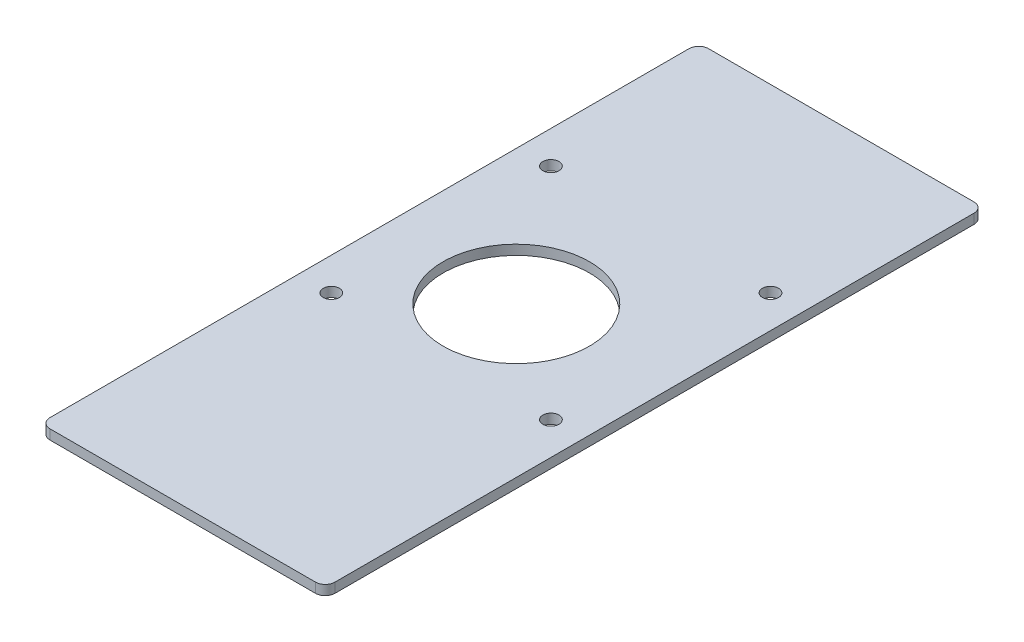
ISO-10303-21;
HEADER;
FILE_DESCRIPTION(('STEP AP214'),'2;1');
FILE_NAME('part.step','',(''),(''),'','','');
FILE_SCHEMA(('AUTOMOTIVE_DESIGN { 1 0 10303 214 1 1 1 1 }'));
ENDSEC;
DATA;
#1=APPLICATION_CONTEXT('core data for automotive mechanical design processes');
#2=APPLICATION_PROTOCOL_DEFINITION('international standard','automotive_design',2000,#1);
#3=PRODUCT_CONTEXT('',#1,'mechanical');
#4=PRODUCT('Part','Part','',(#3));
#5=PRODUCT_RELATED_PRODUCT_CATEGORY('part','',(#4));
#6=PRODUCT_DEFINITION_FORMATION('','',#4);
#7=PRODUCT_DEFINITION_CONTEXT('part definition',#1,'design');
#8=PRODUCT_DEFINITION('design','',#6,#7);
#9=PRODUCT_DEFINITION_SHAPE('','',#8);
#10=(LENGTH_UNIT() NAMED_UNIT(*) SI_UNIT(.MILLI.,.METRE.));
#11=(NAMED_UNIT(*) PLANE_ANGLE_UNIT() SI_UNIT($,.RADIAN.));
#12=(NAMED_UNIT(*) SI_UNIT($,.STERADIAN.) SOLID_ANGLE_UNIT());
#13=UNCERTAINTY_MEASURE_WITH_UNIT(LENGTH_MEASURE(1.E-05),#10,'distance_accuracy_value','');
#14=(GEOMETRIC_REPRESENTATION_CONTEXT(3) GLOBAL_UNCERTAINTY_ASSIGNED_CONTEXT((#13)) GLOBAL_UNIT_ASSIGNED_CONTEXT((#10,
#11,#12)) REPRESENTATION_CONTEXT('',''));
#15=CARTESIAN_POINT('',(0.,0.,0.));
#16=DIRECTION('',(0.,0.,1.));
#17=DIRECTION('',(1.,0.,0.));
#18=AXIS2_PLACEMENT_3D('',#15,#16,#17);
#19=CARTESIAN_POINT('',(-46.6901204704536,2.,-45.7097521955371));
#20=DIRECTION('',(1.,0.,0.));
#21=DIRECTION('',(0.,0.,-1.));
#22=AXIS2_PLACEMENT_3D('',#19,#20,#21);
#23=PLANE('',#22);
#24=DIRECTION('',(0.,0.,1.));
#25=VECTOR('',#24,1.);
#26=CARTESIAN_POINT('',(-46.6901204704536,2.,-45.7097521955371));
#27=LINE('',#26,#25);
#28=CARTESIAN_POINT('',(-46.6901204704536,2.,-43.7097521955371));
#29=VERTEX_POINT('',#28);
#30=CARTESIAN_POINT('',(-46.6901204704536,2.,87.240247804463));
#31=VERTEX_POINT('',#30);
#32=EDGE_CURVE('E129',#29,#31,#27,.T.);
#33=ORIENTED_EDGE('',*,*,#32,.F.);
#34=DIRECTION('',(0.,-1.,0.));
#35=VECTOR('',#34,1.);
#36=CARTESIAN_POINT('',(-46.6901204704536,2.,-43.7097521955371));
#37=LINE('',#36,#35);
#38=CARTESIAN_POINT('',(-46.6901204704536,0.,-43.7097521955371));
#39=VERTEX_POINT('',#38);
#40=EDGE_CURVE('E155',#29,#39,#37,.T.);
#41=ORIENTED_EDGE('',*,*,#40,.T.);
#42=DIRECTION('',(0.,0.,1.));
#43=VECTOR('',#42,1.);
#44=CARTESIAN_POINT('',(-46.6901204704536,0.,-45.7097521955371));
#45=LINE('',#44,#43);
#46=CARTESIAN_POINT('',(-46.6901204704536,0.,87.240247804463));
#47=VERTEX_POINT('',#46);
#48=EDGE_CURVE('E163',#39,#47,#45,.T.);
#49=ORIENTED_EDGE('',*,*,#48,.T.);
#50=DIRECTION('',(0.,-1.,0.));
#51=VECTOR('',#50,1.);
#52=CARTESIAN_POINT('',(-46.6901204704536,2.,87.240247804463));
#53=LINE('',#52,#51);
#54=EDGE_CURVE('E153',#47,#31,#53,.F.);
#55=ORIENTED_EDGE('',*,*,#54,.T.);
#56=EDGE_LOOP('',(#33,#41,#49,#55));
#57=FACE_BOUND('',#56,.T.);
#58=ADVANCED_FACE('F38',(#57),#23,.F.);
#59=CARTESIAN_POINT('',(-46.6901204704536,2.,89.240247804463));
#60=DIRECTION('',(0.,0.,-1.));
#61=DIRECTION('',(-1.,0.,0.));
#62=AXIS2_PLACEMENT_3D('',#59,#60,#61);
#63=PLANE('',#62);
#64=DIRECTION('',(1.,0.,0.));
#65=VECTOR('',#64,1.);
#66=CARTESIAN_POINT('',(-46.6901204704536,0.,89.240247804463));
#67=LINE('',#66,#65);
#68=CARTESIAN_POINT('',(-44.6901204704536,0.,89.240247804463));
#69=VERTEX_POINT('',#68);
#70=CARTESIAN_POINT('',(9.70987952954636,0.,89.240247804463));
#71=VERTEX_POINT('',#70);
#72=EDGE_CURVE('E134',#69,#71,#67,.T.);
#73=ORIENTED_EDGE('',*,*,#72,.T.);
#74=DIRECTION('',(0.,-1.,0.));
#75=VECTOR('',#74,1.);
#76=CARTESIAN_POINT('',(9.70987952954636,2.,89.240247804463));
#77=LINE('',#76,#75);
#78=CARTESIAN_POINT('',(9.70987952954636,2.,89.240247804463));
#79=VERTEX_POINT('',#78);
#80=EDGE_CURVE('E11',#71,#79,#77,.F.);
#81=ORIENTED_EDGE('',*,*,#80,.T.);
#82=DIRECTION('',(1.,0.,0.));
#83=VECTOR('',#82,1.);
#84=CARTESIAN_POINT('',(-46.6901204704536,2.,89.240247804463));
#85=LINE('',#84,#83);
#86=CARTESIAN_POINT('',(-44.6901204704536,2.,89.240247804463));
#87=VERTEX_POINT('',#86);
#88=EDGE_CURVE('E132',#87,#79,#85,.T.);
#89=ORIENTED_EDGE('',*,*,#88,.F.);
#90=DIRECTION('',(0.,-1.,0.));
#91=VECTOR('',#90,1.);
#92=CARTESIAN_POINT('',(-44.6901204704536,2.,89.240247804463));
#93=LINE('',#92,#91);
#94=EDGE_CURVE('E46',#87,#69,#93,.T.);
#95=ORIENTED_EDGE('',*,*,#94,.T.);
#96=EDGE_LOOP('',(#73,#81,#89,#95));
#97=FACE_BOUND('',#96,.T.);
#98=ADVANCED_FACE('F160',(#97),#63,.F.);
#99=CARTESIAN_POINT('',(11.7098795295463,2.,-45.7097521955371));
#100=DIRECTION('',(-1.,0.,0.));
#101=DIRECTION('',(0.,0.,1.));
#102=AXIS2_PLACEMENT_3D('',#99,#100,#101);
#103=PLANE('',#102);
#104=DIRECTION('',(0.,0.,-1.));
#105=VECTOR('',#104,1.);
#106=CARTESIAN_POINT('',(11.7098795295463,0.,-45.7097521955371));
#107=LINE('',#106,#105);
#108=CARTESIAN_POINT('',(11.7098795295464,0.,87.240247804463));
#109=VERTEX_POINT('',#108);
#110=CARTESIAN_POINT('',(11.7098795295463,0.,-43.7097521955371));
#111=VERTEX_POINT('',#110);
#112=EDGE_CURVE('E130',#109,#111,#107,.T.);
#113=ORIENTED_EDGE('',*,*,#112,.T.);
#114=DIRECTION('',(0.,-1.,0.));
#115=VECTOR('',#114,1.);
#116=CARTESIAN_POINT('',(11.7098795295463,2.,-43.7097521955371));
#117=LINE('',#116,#115);
#118=CARTESIAN_POINT('',(11.7098795295463,2.,-43.7097521955371));
#119=VERTEX_POINT('',#118);
#120=EDGE_CURVE('E108',#111,#119,#117,.F.);
#121=ORIENTED_EDGE('',*,*,#120,.T.);
#122=DIRECTION('',(0.,0.,-1.));
#123=VECTOR('',#122,1.);
#124=CARTESIAN_POINT('',(11.7098795295463,2.,-45.7097521955371));
#125=LINE('',#124,#123);
#126=CARTESIAN_POINT('',(11.7098795295464,2.,87.240247804463));
#127=VERTEX_POINT('',#126);
#128=EDGE_CURVE('E168',#127,#119,#125,.T.);
#129=ORIENTED_EDGE('',*,*,#128,.F.);
#130=DIRECTION('',(0.,-1.,0.));
#131=VECTOR('',#130,1.);
#132=CARTESIAN_POINT('',(11.7098795295464,2.,87.240247804463));
#133=LINE('',#132,#131);
#134=EDGE_CURVE('E113',#127,#109,#133,.T.);
#135=ORIENTED_EDGE('',*,*,#134,.T.);
#136=EDGE_LOOP('',(#113,#121,#129,#135));
#137=FACE_BOUND('',#136,.T.);
#138=ADVANCED_FACE('F226',(#137),#103,.F.);
#139=CARTESIAN_POINT('',(-46.6901204704536,2.,-45.7097521955371));
#140=DIRECTION('',(0.,0.,1.));
#141=DIRECTION('',(1.,0.,0.));
#142=AXIS2_PLACEMENT_3D('',#139,#140,#141);
#143=PLANE('',#142);
#144=DIRECTION('',(-1.,0.,0.));
#145=VECTOR('',#144,1.);
#146=CARTESIAN_POINT('',(-46.6901204704536,2.,-45.7097521955371));
#147=LINE('',#146,#145);
#148=CARTESIAN_POINT('',(9.70987952954633,2.,-45.7097521955371));
#149=VERTEX_POINT('',#148);
#150=CARTESIAN_POINT('',(-44.6901204704536,2.,-45.7097521955371));
#151=VERTEX_POINT('',#150);
#152=EDGE_CURVE('E123',#149,#151,#147,.T.);
#153=ORIENTED_EDGE('',*,*,#152,.F.);
#154=DIRECTION('',(0.,-1.,0.));
#155=VECTOR('',#154,1.);
#156=CARTESIAN_POINT('',(9.70987952954633,2.,-45.7097521955371));
#157=LINE('',#156,#155);
#158=CARTESIAN_POINT('',(9.70987952954633,0.,-45.7097521955371));
#159=VERTEX_POINT('',#158);
#160=EDGE_CURVE('E107',#149,#159,#157,.T.);
#161=ORIENTED_EDGE('',*,*,#160,.T.);
#162=DIRECTION('',(-1.,0.,0.));
#163=VECTOR('',#162,1.);
#164=CARTESIAN_POINT('',(-46.6901204704536,0.,-45.7097521955371));
#165=LINE('',#164,#163);
#166=CARTESIAN_POINT('',(-44.6901204704536,0.,-45.7097521955371));
#167=VERTEX_POINT('',#166);
#168=EDGE_CURVE('E120',#159,#167,#165,.T.);
#169=ORIENTED_EDGE('',*,*,#168,.T.);
#170=DIRECTION('',(0.,-1.,0.));
#171=VECTOR('',#170,1.);
#172=CARTESIAN_POINT('',(-44.6901204704536,2.,-45.7097521955371));
#173=LINE('',#172,#171);
#174=EDGE_CURVE('E125',#167,#151,#173,.F.);
#175=ORIENTED_EDGE('',*,*,#174,.T.);
#176=EDGE_LOOP('',(#153,#161,#169,#175));
#177=FACE_BOUND('',#176,.T.);
#178=ADVANCED_FACE('F119',(#177),#143,.F.);
#179=CARTESIAN_POINT('',(0.,2.,0.));
#180=DIRECTION('',(0.,1.,0.));
#181=DIRECTION('',(0.,0.,1.));
#182=AXIS2_PLACEMENT_3D('',#179,#180,#181);
#183=PLANE('',#182);
#184=CARTESIAN_POINT('',(-19.0845322746296,2.,19.2902478044629));
#185=DIRECTION('',(0.,1.,0.));
#186=DIRECTION('',(0.,0.,1.));
#187=AXIS2_PLACEMENT_3D('',#184,#185,#186);
#188=CIRCLE('',#187,15.);
#189=CARTESIAN_POINT('',(-19.0845322746296,2.,34.2902478044629));
#190=VERTEX_POINT('',#189);
#191=EDGE_CURVE('E196',#190,#190,#188,.T.);
#192=ORIENTED_EDGE('',*,*,#191,.F.);
#193=EDGE_LOOP('',(#192));
#194=FACE_BOUND('',#193,.T.);
#195=CARTESIAN_POINT('',(-39.9901204704536,2.,36.2902478044629));
#196=DIRECTION('',(0.,1.,0.));
#197=DIRECTION('',(0.,0.,1.));
#198=AXIS2_PLACEMENT_3D('',#195,#196,#197);
#199=CIRCLE('',#198,1.65);
#200=CARTESIAN_POINT('',(-39.9901204704536,2.,37.9402478044629));
#201=VERTEX_POINT('',#200);
#202=EDGE_CURVE('E178',#201,#201,#199,.T.);
#203=ORIENTED_EDGE('',*,*,#202,.F.);
#204=EDGE_LOOP('',(#203));
#205=FACE_BOUND('',#204,.T.);
#206=CARTESIAN_POINT('',(5.00987952954635,2.,36.2902478044629));
#207=DIRECTION('',(0.,1.,0.));
#208=DIRECTION('',(0.,0.,1.));
#209=AXIS2_PLACEMENT_3D('',#206,#207,#208);
#210=CIRCLE('',#209,1.65);
#211=CARTESIAN_POINT('',(5.00987952954635,2.,37.9402478044629));
#212=VERTEX_POINT('',#211);
#213=EDGE_CURVE('E185',#212,#212,#210,.T.);
#214=ORIENTED_EDGE('',*,*,#213,.F.);
#215=EDGE_LOOP('',(#214));
#216=FACE_BOUND('',#215,.T.);
#217=CARTESIAN_POINT('',(5.00987952954635,2.,-8.70975219553706));
#218=DIRECTION('',(0.,1.,0.));
#219=DIRECTION('',(0.,0.,1.));
#220=AXIS2_PLACEMENT_3D('',#217,#218,#219);
#221=CIRCLE('',#220,1.65);
#222=CARTESIAN_POINT('',(5.00987952954635,2.,-7.05975219553706));
#223=VERTEX_POINT('',#222);
#224=EDGE_CURVE('E191',#223,#223,#221,.T.);
#225=ORIENTED_EDGE('',*,*,#224,.F.);
#226=EDGE_LOOP('',(#225));
#227=FACE_BOUND('',#226,.T.);
#228=CARTESIAN_POINT('',(-39.9901204704537,2.,-8.70975219553706));
#229=DIRECTION('',(0.,1.,0.));
#230=DIRECTION('',(0.,0.,1.));
#231=AXIS2_PLACEMENT_3D('',#228,#229,#230);
#232=CIRCLE('',#231,1.65);
#233=CARTESIAN_POINT('',(-39.9901204704537,2.,-7.05975219553706));
#234=VERTEX_POINT('',#233);
#235=EDGE_CURVE('E172',#234,#234,#232,.T.);
#236=ORIENTED_EDGE('',*,*,#235,.F.);
#237=EDGE_LOOP('',(#236));
#238=FACE_BOUND('',#237,.T.);
#239=ORIENTED_EDGE('',*,*,#128,.T.);
#240=CARTESIAN_POINT('',(9.70987952954633,2.,-43.7097521955371));
#241=DIRECTION('',(0.,1.,0.));
#242=DIRECTION('',(0.,0.,1.));
#243=AXIS2_PLACEMENT_3D('',#240,#241,#242);
#244=CIRCLE('',#243,2.);
#245=EDGE_CURVE('E151',#119,#149,#244,.T.);
#246=ORIENTED_EDGE('',*,*,#245,.T.);
#247=ORIENTED_EDGE('',*,*,#152,.T.);
#248=CARTESIAN_POINT('',(-44.6901204704536,2.,-43.7097521955371));
#249=DIRECTION('',(0.,1.,0.));
#250=DIRECTION('',(0.,0.,1.));
#251=AXIS2_PLACEMENT_3D('',#248,#249,#250);
#252=CIRCLE('',#251,2.);
#253=EDGE_CURVE('E149',#151,#29,#252,.T.);
#254=ORIENTED_EDGE('',*,*,#253,.T.);
#255=ORIENTED_EDGE('',*,*,#32,.T.);
#256=CARTESIAN_POINT('',(-44.6901204704536,2.,87.240247804463));
#257=DIRECTION('',(0.,1.,0.));
#258=DIRECTION('',(0.,0.,1.));
#259=AXIS2_PLACEMENT_3D('',#256,#257,#258);
#260=CIRCLE('',#259,2.);
#261=EDGE_CURVE('E58',#31,#87,#260,.T.);
#262=ORIENTED_EDGE('',*,*,#261,.T.);
#263=ORIENTED_EDGE('',*,*,#88,.T.);
#264=CARTESIAN_POINT('',(9.70987952954636,2.,87.240247804463));
#265=DIRECTION('',(0.,1.,0.));
#266=DIRECTION('',(0.,0.,1.));
#267=AXIS2_PLACEMENT_3D('',#264,#265,#266);
#268=CIRCLE('',#267,2.);
#269=EDGE_CURVE('E147',#79,#127,#268,.T.);
#270=ORIENTED_EDGE('',*,*,#269,.T.);
#271=EDGE_LOOP('',(#239,#246,#247,#254,#255,#262,#263,#270));
#272=FACE_BOUND('',#271,.T.);
#273=ADVANCED_FACE('F211',(#194,#205,#216,#227,#238,#272),#183,.T.);
#274=CARTESIAN_POINT('',(0.,0.,0.));
#275=DIRECTION('',(0.,1.,0.));
#276=DIRECTION('',(0.,0.,1.));
#277=AXIS2_PLACEMENT_3D('',#274,#275,#276);
#278=PLANE('',#277);
#279=CARTESIAN_POINT('',(-19.0845322746296,0.,19.2902478044629));
#280=DIRECTION('',(0.,1.,0.));
#281=DIRECTION('',(0.,0.,1.));
#282=AXIS2_PLACEMENT_3D('',#279,#280,#281);
#283=CIRCLE('',#282,15.);
#284=CARTESIAN_POINT('',(-19.0845322746296,0.,34.2902478044629));
#285=VERTEX_POINT('',#284);
#286=EDGE_CURVE('E182',#285,#285,#283,.T.);
#287=ORIENTED_EDGE('',*,*,#286,.T.);
#288=EDGE_LOOP('',(#287));
#289=FACE_BOUND('',#288,.T.);
#290=CARTESIAN_POINT('',(-39.9901204704536,0.,36.2902478044629));
#291=DIRECTION('',(0.,1.,0.));
#292=DIRECTION('',(0.,0.,1.));
#293=AXIS2_PLACEMENT_3D('',#290,#291,#292);
#294=CIRCLE('',#293,1.65);
#295=CARTESIAN_POINT('',(-39.9901204704536,0.,37.9402478044629));
#296=VERTEX_POINT('',#295);
#297=EDGE_CURVE('E181',#296,#296,#294,.T.);
#298=ORIENTED_EDGE('',*,*,#297,.T.);
#299=EDGE_LOOP('',(#298));
#300=FACE_BOUND('',#299,.T.);
#301=CARTESIAN_POINT('',(5.00987952954635,0.,36.2902478044629));
#302=DIRECTION('',(0.,1.,0.));
#303=DIRECTION('',(0.,0.,1.));
#304=AXIS2_PLACEMENT_3D('',#301,#302,#303);
#305=CIRCLE('',#304,1.65);
#306=CARTESIAN_POINT('',(5.00987952954635,0.,37.9402478044629));
#307=VERTEX_POINT('',#306);
#308=EDGE_CURVE('E188',#307,#307,#305,.T.);
#309=ORIENTED_EDGE('',*,*,#308,.T.);
#310=EDGE_LOOP('',(#309));
#311=FACE_BOUND('',#310,.T.);
#312=CARTESIAN_POINT('',(5.00987952954635,0.,-8.70975219553706));
#313=DIRECTION('',(0.,1.,0.));
#314=DIRECTION('',(0.,0.,1.));
#315=AXIS2_PLACEMENT_3D('',#312,#313,#314);
#316=CIRCLE('',#315,1.65);
#317=CARTESIAN_POINT('',(5.00987952954635,0.,-7.05975219553706));
#318=VERTEX_POINT('',#317);
#319=EDGE_CURVE('E175',#318,#318,#316,.T.);
#320=ORIENTED_EDGE('',*,*,#319,.T.);
#321=EDGE_LOOP('',(#320));
#322=FACE_BOUND('',#321,.T.);
#323=CARTESIAN_POINT('',(-39.9901204704537,0.,-8.70975219553706));
#324=DIRECTION('',(0.,1.,0.));
#325=DIRECTION('',(0.,0.,1.));
#326=AXIS2_PLACEMENT_3D('',#323,#324,#325);
#327=CIRCLE('',#326,1.65);
#328=CARTESIAN_POINT('',(-39.9901204704537,0.,-7.05975219553706));
#329=VERTEX_POINT('',#328);
#330=EDGE_CURVE('E164',#329,#329,#327,.T.);
#331=ORIENTED_EDGE('',*,*,#330,.T.);
#332=EDGE_LOOP('',(#331));
#333=FACE_BOUND('',#332,.T.);
#334=ORIENTED_EDGE('',*,*,#168,.F.);
#335=CARTESIAN_POINT('',(9.70987952954633,0.,-43.7097521955371));
#336=DIRECTION('',(0.,1.,0.));
#337=DIRECTION('',(0.,0.,1.));
#338=AXIS2_PLACEMENT_3D('',#335,#336,#337);
#339=CIRCLE('',#338,2.);
#340=EDGE_CURVE('E103',#159,#111,#339,.F.);
#341=ORIENTED_EDGE('',*,*,#340,.T.);
#342=ORIENTED_EDGE('',*,*,#112,.F.);
#343=CARTESIAN_POINT('',(9.70987952954636,0.,87.240247804463));
#344=DIRECTION('',(0.,1.,0.));
#345=DIRECTION('',(0.,0.,1.));
#346=AXIS2_PLACEMENT_3D('',#343,#344,#345);
#347=CIRCLE('',#346,2.);
#348=EDGE_CURVE('E140',#109,#71,#347,.F.);
#349=ORIENTED_EDGE('',*,*,#348,.T.);
#350=ORIENTED_EDGE('',*,*,#72,.F.);
#351=CARTESIAN_POINT('',(-44.6901204704536,0.,87.240247804463));
#352=DIRECTION('',(0.,1.,0.));
#353=DIRECTION('',(0.,0.,1.));
#354=AXIS2_PLACEMENT_3D('',#351,#352,#353);
#355=CIRCLE('',#354,2.);
#356=EDGE_CURVE('E124',#69,#47,#355,.F.);
#357=ORIENTED_EDGE('',*,*,#356,.T.);
#358=ORIENTED_EDGE('',*,*,#48,.F.);
#359=CARTESIAN_POINT('',(-44.6901204704536,0.,-43.7097521955371));
#360=DIRECTION('',(0.,1.,0.));
#361=DIRECTION('',(0.,0.,1.));
#362=AXIS2_PLACEMENT_3D('',#359,#360,#361);
#363=CIRCLE('',#362,2.);
#364=EDGE_CURVE('E114',#39,#167,#363,.F.);
#365=ORIENTED_EDGE('',*,*,#364,.T.);
#366=EDGE_LOOP('',(#334,#341,#342,#349,#350,#357,#358,#365));
#367=FACE_BOUND('',#366,.T.);
#368=ADVANCED_FACE('F127',(#289,#300,#311,#322,#333,#367),#278,.F.);
#369=CARTESIAN_POINT('',(9.70987952954633,2.,-43.7097521955371));
#370=DIRECTION('',(0.,-1.,0.));
#371=DIRECTION('',(0.,0.,-1.));
#372=AXIS2_PLACEMENT_3D('',#369,#370,#371);
#373=CYLINDRICAL_SURFACE('',#372,2.);
#374=ORIENTED_EDGE('',*,*,#245,.F.);
#375=ORIENTED_EDGE('',*,*,#120,.F.);
#376=ORIENTED_EDGE('',*,*,#340,.F.);
#377=ORIENTED_EDGE('',*,*,#160,.F.);
#378=EDGE_LOOP('',(#374,#375,#376,#377));
#379=FACE_BOUND('',#378,.T.);
#380=ADVANCED_FACE('F106',(#379),#373,.T.);
#381=CARTESIAN_POINT('',(-44.6901204704536,2.,-43.7097521955371));
#382=DIRECTION('',(0.,-1.,0.));
#383=DIRECTION('',(0.,0.,-1.));
#384=AXIS2_PLACEMENT_3D('',#381,#382,#383);
#385=CYLINDRICAL_SURFACE('',#384,2.);
#386=ORIENTED_EDGE('',*,*,#253,.F.);
#387=ORIENTED_EDGE('',*,*,#174,.F.);
#388=ORIENTED_EDGE('',*,*,#364,.F.);
#389=ORIENTED_EDGE('',*,*,#40,.F.);
#390=EDGE_LOOP('',(#386,#387,#388,#389));
#391=FACE_BOUND('',#390,.T.);
#392=ADVANCED_FACE('F230',(#391),#385,.T.);
#393=CARTESIAN_POINT('',(9.70987952954636,2.,87.240247804463));
#394=DIRECTION('',(0.,-1.,0.));
#395=DIRECTION('',(0.,0.,-1.));
#396=AXIS2_PLACEMENT_3D('',#393,#394,#395);
#397=CYLINDRICAL_SURFACE('',#396,2.);
#398=ORIENTED_EDGE('',*,*,#269,.F.);
#399=ORIENTED_EDGE('',*,*,#80,.F.);
#400=ORIENTED_EDGE('',*,*,#348,.F.);
#401=ORIENTED_EDGE('',*,*,#134,.F.);
#402=EDGE_LOOP('',(#398,#399,#400,#401));
#403=FACE_BOUND('',#402,.T.);
#404=ADVANCED_FACE('F228',(#403),#397,.T.);
#405=CARTESIAN_POINT('',(-44.6901204704536,2.,87.240247804463));
#406=DIRECTION('',(0.,-1.,0.));
#407=DIRECTION('',(0.,0.,-1.));
#408=AXIS2_PLACEMENT_3D('',#405,#406,#407);
#409=CYLINDRICAL_SURFACE('',#408,2.);
#410=ORIENTED_EDGE('',*,*,#261,.F.);
#411=ORIENTED_EDGE('',*,*,#54,.F.);
#412=ORIENTED_EDGE('',*,*,#356,.F.);
#413=ORIENTED_EDGE('',*,*,#94,.F.);
#414=EDGE_LOOP('',(#410,#411,#412,#413));
#415=FACE_BOUND('',#414,.T.);
#416=ADVANCED_FACE('F40',(#415),#409,.T.);
#417=CARTESIAN_POINT('',(-39.9901204704537,0.,-8.70975219553706));
#418=DIRECTION('',(0.,1.,0.));
#419=DIRECTION('',(0.,0.,1.));
#420=AXIS2_PLACEMENT_3D('',#417,#418,#419);
#421=CYLINDRICAL_SURFACE('',#420,1.65);
#422=ORIENTED_EDGE('',*,*,#330,.F.);
#423=EDGE_LOOP('',(#422));
#424=FACE_BOUND('',#423,.T.);
#425=ORIENTED_EDGE('',*,*,#235,.T.);
#426=EDGE_LOOP('',(#425));
#427=FACE_BOUND('',#426,.T.);
#428=ADVANCED_FACE('F235',(#424,#427),#421,.F.);
#429=CARTESIAN_POINT('',(5.00987952954635,0.,-8.70975219553706));
#430=DIRECTION('',(0.,1.,0.));
#431=DIRECTION('',(0.,0.,1.));
#432=AXIS2_PLACEMENT_3D('',#429,#430,#431);
#433=CYLINDRICAL_SURFACE('',#432,1.65);
#434=ORIENTED_EDGE('',*,*,#319,.F.);
#435=EDGE_LOOP('',(#434));
#436=FACE_BOUND('',#435,.T.);
#437=ORIENTED_EDGE('',*,*,#224,.T.);
#438=EDGE_LOOP('',(#437));
#439=FACE_BOUND('',#438,.T.);
#440=ADVANCED_FACE('F298',(#436,#439),#433,.F.);
#441=CARTESIAN_POINT('',(5.00987952954635,0.,36.2902478044629));
#442=DIRECTION('',(0.,1.,0.));
#443=DIRECTION('',(0.,0.,1.));
#444=AXIS2_PLACEMENT_3D('',#441,#442,#443);
#445=CYLINDRICAL_SURFACE('',#444,1.65);
#446=ORIENTED_EDGE('',*,*,#308,.F.);
#447=EDGE_LOOP('',(#446));
#448=FACE_BOUND('',#447,.T.);
#449=ORIENTED_EDGE('',*,*,#213,.T.);
#450=EDGE_LOOP('',(#449));
#451=FACE_BOUND('',#450,.T.);
#452=ADVANCED_FACE('F293',(#448,#451),#445,.F.);
#453=CARTESIAN_POINT('',(-39.9901204704536,0.,36.2902478044629));
#454=DIRECTION('',(0.,1.,0.));
#455=DIRECTION('',(0.,0.,1.));
#456=AXIS2_PLACEMENT_3D('',#453,#454,#455);
#457=CYLINDRICAL_SURFACE('',#456,1.65);
#458=ORIENTED_EDGE('',*,*,#297,.F.);
#459=EDGE_LOOP('',(#458));
#460=FACE_BOUND('',#459,.T.);
#461=ORIENTED_EDGE('',*,*,#202,.T.);
#462=EDGE_LOOP('',(#461));
#463=FACE_BOUND('',#462,.T.);
#464=ADVANCED_FACE('F207',(#460,#463),#457,.F.);
#465=CARTESIAN_POINT('',(-19.0845322746296,0.,19.2902478044629));
#466=DIRECTION('',(0.,1.,0.));
#467=DIRECTION('',(0.,0.,1.));
#468=AXIS2_PLACEMENT_3D('',#465,#466,#467);
#469=CYLINDRICAL_SURFACE('',#468,15.);
#470=ORIENTED_EDGE('',*,*,#286,.F.);
#471=EDGE_LOOP('',(#470));
#472=FACE_BOUND('',#471,.T.);
#473=ORIENTED_EDGE('',*,*,#191,.T.);
#474=EDGE_LOOP('',(#473));
#475=FACE_BOUND('',#474,.T.);
#476=ADVANCED_FACE('F204',(#472,#475),#469,.F.);
#477=CLOSED_SHELL('',(#58,#98,#138,#178,#273,#368,#380,#392,#404,#416,#428,#440,#452,#464,#476));
#478=MANIFOLD_SOLID_BREP('B2',#477);
#479=ADVANCED_BREP_SHAPE_REPRESENTATION('',(#18,#478),#14);
#480=SHAPE_DEFINITION_REPRESENTATION(#9,#479);
ENDSEC;
END-ISO-10303-21;
